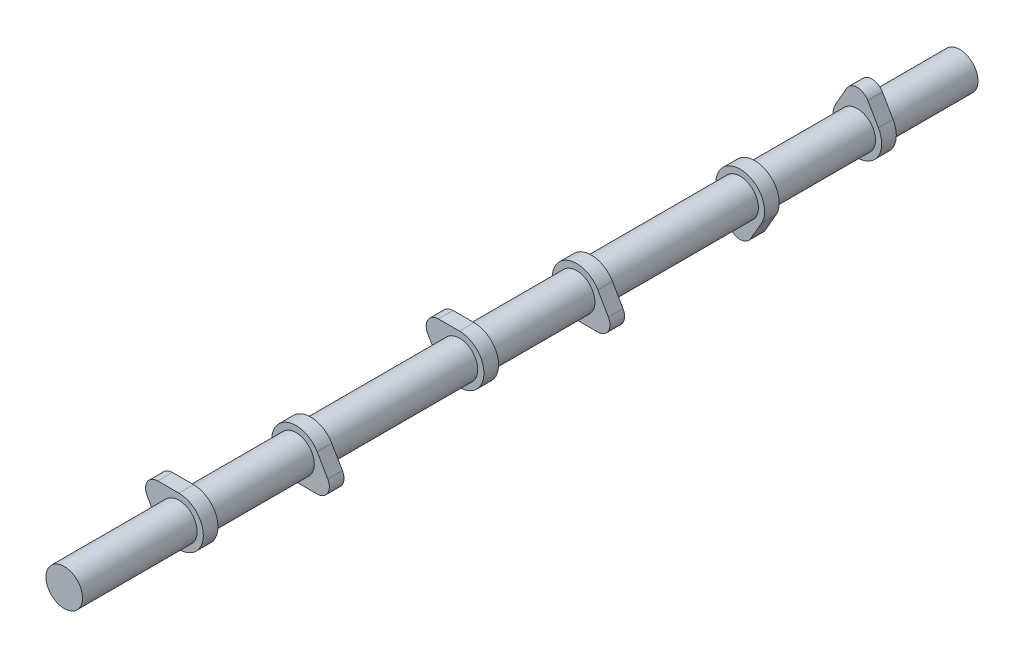
ISO-10303-21;
HEADER;
FILE_DESCRIPTION(('STEP AP214'),'2;1');
FILE_NAME('part.step','',(''),(''),'','','');
FILE_SCHEMA(('AUTOMOTIVE_DESIGN { 1 0 10303 214 1 1 1 1 }'));
ENDSEC;
DATA;
#1=APPLICATION_CONTEXT('core data for automotive mechanical design processes');
#2=APPLICATION_PROTOCOL_DEFINITION('international standard','automotive_design',2000,#1);
#3=PRODUCT_CONTEXT('',#1,'mechanical');
#4=PRODUCT('Part','Part','',(#3));
#5=PRODUCT_RELATED_PRODUCT_CATEGORY('part','',(#4));
#6=PRODUCT_DEFINITION_FORMATION('','',#4);
#7=PRODUCT_DEFINITION_CONTEXT('part definition',#1,'design');
#8=PRODUCT_DEFINITION('design','',#6,#7);
#9=PRODUCT_DEFINITION_SHAPE('','',#8);
#10=(LENGTH_UNIT() NAMED_UNIT(*) SI_UNIT(.MILLI.,.METRE.));
#11=(NAMED_UNIT(*) PLANE_ANGLE_UNIT() SI_UNIT($,.RADIAN.));
#12=(NAMED_UNIT(*) SI_UNIT($,.STERADIAN.) SOLID_ANGLE_UNIT());
#13=UNCERTAINTY_MEASURE_WITH_UNIT(LENGTH_MEASURE(1.E-05),#10,'distance_accuracy_value','');
#14=(GEOMETRIC_REPRESENTATION_CONTEXT(3) GLOBAL_UNCERTAINTY_ASSIGNED_CONTEXT((#13)) GLOBAL_UNIT_ASSIGNED_CONTEXT((#10,
#11,#12)) REPRESENTATION_CONTEXT('',''));
#15=CARTESIAN_POINT('',(0.,0.,0.));
#16=DIRECTION('',(0.,0.,1.));
#17=DIRECTION('',(1.,0.,0.));
#18=AXIS2_PLACEMENT_3D('',#15,#16,#17);
#19=CARTESIAN_POINT('',(0.,0.,124.46));
#20=DIRECTION('',(0.,0.,-1.));
#21=DIRECTION('',(-1.,0.,0.));
#22=AXIS2_PLACEMENT_3D('',#19,#20,#21);
#23=CYLINDRICAL_SURFACE('',#22,9.5);
#24=CARTESIAN_POINT('',(0.,0.,64.77));
#25=DIRECTION('',(0.,0.,1.));
#26=DIRECTION('',(1.,0.,0.));
#27=AXIS2_PLACEMENT_3D('',#24,#25,#26);
#28=CIRCLE('',#27,9.5);
#29=CARTESIAN_POINT('',(9.5,0.,64.77));
#30=VERTEX_POINT('',#29);
#31=EDGE_CURVE('E246',#30,#30,#28,.T.);
#32=ORIENTED_EDGE('',*,*,#31,.T.);
#33=EDGE_LOOP('',(#32));
#34=FACE_BOUND('',#33,.T.);
#35=CARTESIAN_POINT('',(0.,0.,142.24));
#36=DIRECTION('',(0.,0.,1.));
#37=DIRECTION('',(1.,0.,0.));
#38=AXIS2_PLACEMENT_3D('',#35,#36,#37);
#39=CIRCLE('',#38,9.5);
#40=CARTESIAN_POINT('',(9.5,0.,142.24));
#41=VERTEX_POINT('',#40);
#42=EDGE_CURVE('E392',#41,#41,#39,.F.);
#43=ORIENTED_EDGE('',*,*,#42,.T.);
#44=EDGE_LOOP('',(#43));
#45=FACE_BOUND('',#44,.T.);
#46=ADVANCED_FACE('F47',(#34,#45),#23,.T.);
#47=CARTESIAN_POINT('',(10.9985226280624,-6.3499999999999,295.91));
#48=DIRECTION('',(0.,0.,-1.));
#49=DIRECTION('',(0.499999999999992,0.866025403784443,0.));
#50=AXIS2_PLACEMENT_3D('',#47,#48,#49);
#51=CYLINDRICAL_SURFACE('',#50,6.35);
#52=CARTESIAN_POINT('',(10.9985226280624,-6.3499999999999,288.29));
#53=DIRECTION('',(0.,0.,1.));
#54=DIRECTION('',(-0.499999999999992,-0.866025403784443,0.));
#55=AXIS2_PLACEMENT_3D('',#52,#53,#54);
#56=CIRCLE('',#55,6.35);
#57=CARTESIAN_POINT('',(10.9985226280625,-12.6999999999999,288.29));
#58=VERTEX_POINT('',#57);
#59=CARTESIAN_POINT('',(16.4977839420936,-3.17499999999985,288.29));
#60=VERTEX_POINT('',#59);
#61=EDGE_CURVE('E398',#58,#60,#56,.T.);
#62=ORIENTED_EDGE('',*,*,#61,.T.);
#63=DIRECTION('',(0.,0.,-1.));
#64=VECTOR('',#63,1.);
#65=CARTESIAN_POINT('',(16.4977839420936,-3.17499999999985,295.91));
#66=LINE('',#65,#64);
#67=CARTESIAN_POINT('',(16.4977839420936,-3.17499999999985,295.91));
#68=VERTEX_POINT('',#67);
#69=EDGE_CURVE('E417',#68,#60,#66,.T.);
#70=ORIENTED_EDGE('',*,*,#69,.F.);
#71=CARTESIAN_POINT('',(10.9985226280624,-6.3499999999999,295.91));
#72=DIRECTION('',(0.,0.,1.));
#73=DIRECTION('',(-0.499999999999992,-0.866025403784443,0.));
#74=AXIS2_PLACEMENT_3D('',#71,#72,#73);
#75=CIRCLE('',#74,6.35);
#76=CARTESIAN_POINT('',(10.9985226280625,-12.6999999999999,295.91));
#77=VERTEX_POINT('',#76);
#78=EDGE_CURVE('E399',#77,#68,#75,.T.);
#79=ORIENTED_EDGE('',*,*,#78,.F.);
#80=DIRECTION('',(0.,0.,-1.));
#81=VECTOR('',#80,1.);
#82=CARTESIAN_POINT('',(10.9985226280625,-12.6999999999999,295.91));
#83=LINE('',#82,#81);
#84=EDGE_CURVE('E405',#77,#58,#83,.T.);
#85=ORIENTED_EDGE('',*,*,#84,.T.);
#86=EDGE_LOOP('',(#62,#70,#79,#85));
#87=FACE_BOUND('',#86,.T.);
#88=ADVANCED_FACE('F465',(#87),#51,.T.);
#89=CARTESIAN_POINT('',(16.4977839420936,-3.17499999999985,295.91));
#90=DIRECTION('',(-0.866025403784434,-0.500000000000008,0.));
#91=DIRECTION('',(0.500000000000009,-0.866025403784434,0.));
#92=AXIS2_PLACEMENT_3D('',#89,#90,#91);
#93=PLANE('',#92);
#94=DIRECTION('',(-0.500000000000009,0.866025403784434,0.));
#95=VECTOR('',#94,1.);
#96=CARTESIAN_POINT('',(16.4977839420936,-3.17499999999985,288.29));
#97=LINE('',#96,#95);
#98=CARTESIAN_POINT('',(10.9985226280623,6.3500000000001,288.29));
#99=VERTEX_POINT('',#98);
#100=EDGE_CURVE('E408',#60,#99,#97,.T.);
#101=ORIENTED_EDGE('',*,*,#100,.T.);
#102=DIRECTION('',(0.,0.,-1.));
#103=VECTOR('',#102,1.);
#104=CARTESIAN_POINT('',(10.9985226280623,6.3500000000001,295.91));
#105=LINE('',#104,#103);
#106=CARTESIAN_POINT('',(10.9985226280623,6.3500000000001,295.91));
#107=VERTEX_POINT('',#106);
#108=EDGE_CURVE('E415',#107,#99,#105,.T.);
#109=ORIENTED_EDGE('',*,*,#108,.F.);
#110=DIRECTION('',(-0.500000000000009,0.866025403784434,0.));
#111=VECTOR('',#110,1.);
#112=CARTESIAN_POINT('',(16.4977839420936,-3.17499999999985,295.91));
#113=LINE('',#112,#111);
#114=EDGE_CURVE('E98',#68,#107,#113,.T.);
#115=ORIENTED_EDGE('',*,*,#114,.F.);
#116=ORIENTED_EDGE('',*,*,#69,.T.);
#117=EDGE_LOOP('',(#101,#109,#115,#116));
#118=FACE_BOUND('',#117,.T.);
#119=ADVANCED_FACE('F469',(#118),#93,.F.);
#120=CARTESIAN_POINT('',(0.,0.,295.91));
#121=DIRECTION('',(0.,0.,-1.));
#122=DIRECTION('',(0.499999999999992,0.866025403784443,0.));
#123=AXIS2_PLACEMENT_3D('',#120,#121,#122);
#124=CYLINDRICAL_SURFACE('',#123,12.7);
#125=CARTESIAN_POINT('',(0.,0.,288.29));
#126=DIRECTION('',(0.,0.,1.));
#127=DIRECTION('',(-0.499999999999992,-0.866025403784443,0.));
#128=AXIS2_PLACEMENT_3D('',#125,#126,#127);
#129=CIRCLE('',#128,12.7);
#130=CARTESIAN_POINT('',(1.17961196366423E-13,-12.7,288.29));
#131=VERTEX_POINT('',#130);
#132=EDGE_CURVE('E84',#99,#131,#129,.T.);
#133=ORIENTED_EDGE('',*,*,#132,.T.);
#134=DIRECTION('',(0.,0.,-1.));
#135=VECTOR('',#134,1.);
#136=CARTESIAN_POINT('',(1.17961196366423E-13,-12.7,295.91));
#137=LINE('',#136,#135);
#138=CARTESIAN_POINT('',(1.17961196366423E-13,-12.7,295.91));
#139=VERTEX_POINT('',#138);
#140=EDGE_CURVE('E413',#139,#131,#137,.T.);
#141=ORIENTED_EDGE('',*,*,#140,.F.);
#142=CARTESIAN_POINT('',(0.,0.,295.91));
#143=DIRECTION('',(0.,0.,1.));
#144=DIRECTION('',(-0.499999999999992,-0.866025403784443,0.));
#145=AXIS2_PLACEMENT_3D('',#142,#143,#144);
#146=CIRCLE('',#145,12.7);
#147=EDGE_CURVE('E402',#107,#139,#146,.T.);
#148=ORIENTED_EDGE('',*,*,#147,.F.);
#149=ORIENTED_EDGE('',*,*,#108,.T.);
#150=EDGE_LOOP('',(#133,#141,#148,#149));
#151=FACE_BOUND('',#150,.T.);
#152=ADVANCED_FACE('F816',(#151),#124,.T.);
#153=CARTESIAN_POINT('',(10.9985226280625,-12.6999999999999,295.91));
#154=DIRECTION('',(0.,1.,0.));
#155=DIRECTION('',(-1.,0.,0.));
#156=AXIS2_PLACEMENT_3D('',#153,#154,#155);
#157=PLANE('',#156);
#158=DIRECTION('',(1.,0.,0.));
#159=VECTOR('',#158,1.);
#160=CARTESIAN_POINT('',(10.9985226280625,-12.6999999999999,288.29));
#161=LINE('',#160,#159);
#162=EDGE_CURVE('E90',#131,#58,#161,.T.);
#163=ORIENTED_EDGE('',*,*,#162,.T.);
#164=ORIENTED_EDGE('',*,*,#84,.F.);
#165=DIRECTION('',(1.,0.,0.));
#166=VECTOR('',#165,1.);
#167=CARTESIAN_POINT('',(10.9985226280625,-12.6999999999999,295.91));
#168=LINE('',#167,#166);
#169=EDGE_CURVE('E66',#139,#77,#168,.T.);
#170=ORIENTED_EDGE('',*,*,#169,.F.);
#171=ORIENTED_EDGE('',*,*,#140,.T.);
#172=EDGE_LOOP('',(#163,#164,#170,#171));
#173=FACE_BOUND('',#172,.T.);
#174=ADVANCED_FACE('F806',(#173),#157,.F.);
#175=CARTESIAN_POINT('',(10.9985226280624,-6.3499999999999,295.91));
#176=DIRECTION('',(0.,0.,1.));
#177=DIRECTION('',(-0.499999999999992,-0.866025403784443,0.));
#178=AXIS2_PLACEMENT_3D('',#175,#176,#177);
#179=PLANE('',#178);
#180=CARTESIAN_POINT('',(0.,0.,295.91));
#181=DIRECTION('',(0.,0.,1.));
#182=DIRECTION('',(1.,0.,0.));
#183=AXIS2_PLACEMENT_3D('',#180,#181,#182);
#184=CIRCLE('',#183,9.5);
#185=CARTESIAN_POINT('',(9.5,0.,295.91));
#186=VERTEX_POINT('',#185);
#187=EDGE_CURVE('E395',#186,#186,#184,.F.);
#188=ORIENTED_EDGE('',*,*,#187,.T.);
#189=EDGE_LOOP('',(#188));
#190=FACE_BOUND('',#189,.T.);
#191=ORIENTED_EDGE('',*,*,#78,.T.);
#192=ORIENTED_EDGE('',*,*,#114,.T.);
#193=ORIENTED_EDGE('',*,*,#147,.T.);
#194=ORIENTED_EDGE('',*,*,#169,.T.);
#195=EDGE_LOOP('',(#191,#192,#193,#194));
#196=FACE_BOUND('',#195,.T.);
#197=ADVANCED_FACE('F796',(#190,#196),#179,.T.);
#198=CARTESIAN_POINT('',(10.9985226280624,-6.3499999999999,288.29));
#199=DIRECTION('',(0.,0.,1.));
#200=DIRECTION('',(-0.499999999999992,-0.866025403784443,0.));
#201=AXIS2_PLACEMENT_3D('',#198,#199,#200);
#202=PLANE('',#201);
#203=CARTESIAN_POINT('',(0.,0.,288.29));
#204=DIRECTION('',(0.,0.,1.));
#205=DIRECTION('',(1.,0.,0.));
#206=AXIS2_PLACEMENT_3D('',#203,#204,#205);
#207=CIRCLE('',#206,9.5);
#208=CARTESIAN_POINT('',(9.5,0.,288.29));
#209=VERTEX_POINT('',#208);
#210=EDGE_CURVE('E419',#209,#209,#207,.F.);
#211=ORIENTED_EDGE('',*,*,#210,.F.);
#212=EDGE_LOOP('',(#211));
#213=FACE_BOUND('',#212,.T.);
#214=ORIENTED_EDGE('',*,*,#61,.F.);
#215=ORIENTED_EDGE('',*,*,#162,.F.);
#216=ORIENTED_EDGE('',*,*,#132,.F.);
#217=ORIENTED_EDGE('',*,*,#100,.F.);
#218=EDGE_LOOP('',(#214,#215,#216,#217));
#219=FACE_BOUND('',#218,.T.);
#220=ADVANCED_FACE('F786',(#213,#219),#202,.F.);
#221=CARTESIAN_POINT('',(0.,0.,270.51));
#222=DIRECTION('',(0.,0.,-1.));
#223=DIRECTION('',(-1.,0.,0.));
#224=AXIS2_PLACEMENT_3D('',#221,#222,#223);
#225=CYLINDRICAL_SURFACE('',#224,9.5);
#226=CARTESIAN_POINT('',(0.,0.,149.86));
#227=DIRECTION('',(0.,0.,1.));
#228=DIRECTION('',(1.,0.,0.));
#229=AXIS2_PLACEMENT_3D('',#226,#227,#228);
#230=CIRCLE('',#229,9.5);
#231=CARTESIAN_POINT('',(9.5,0.,149.86));
#232=VERTEX_POINT('',#231);
#233=EDGE_CURVE('E357',#232,#232,#230,.F.);
#234=ORIENTED_EDGE('',*,*,#233,.F.);
#235=EDGE_LOOP('',(#234));
#236=FACE_BOUND('',#235,.T.);
#237=CARTESIAN_POINT('',(0.,0.,203.2));
#238=DIRECTION('',(0.,0.,1.));
#239=DIRECTION('',(1.,0.,0.));
#240=AXIS2_PLACEMENT_3D('',#237,#238,#239);
#241=CIRCLE('',#240,9.5);
#242=CARTESIAN_POINT('',(9.5,0.,203.2));
#243=VERTEX_POINT('',#242);
#244=EDGE_CURVE('E346',#243,#243,#241,.T.);
#245=ORIENTED_EDGE('',*,*,#244,.F.);
#246=EDGE_LOOP('',(#245));
#247=FACE_BOUND('',#246,.T.);
#248=ADVANCED_FACE('F776',(#236,#247),#225,.T.);
#249=CARTESIAN_POINT('',(-10.9985226280623,6.35000000000013,203.2));
#250=DIRECTION('',(0.,0.,1.));
#251=DIRECTION('',(0.50000000000001,0.866025403784433,0.));
#252=AXIS2_PLACEMENT_3D('',#249,#250,#251);
#253=PLANE('',#252);
#254=ORIENTED_EDGE('',*,*,#244,.T.);
#255=EDGE_LOOP('',(#254));
#256=FACE_BOUND('',#255,.T.);
#257=CARTESIAN_POINT('',(-10.9985226280623,6.35000000000013,203.2));
#258=DIRECTION('',(0.,0.,1.));
#259=DIRECTION('',(0.50000000000001,0.866025403784433,0.));
#260=AXIS2_PLACEMENT_3D('',#257,#258,#259);
#261=CIRCLE('',#260,6.35);
#262=CARTESIAN_POINT('',(-10.9985226280622,12.7000000000001,203.2));
#263=VERTEX_POINT('',#262);
#264=CARTESIAN_POINT('',(-16.4977839420935,3.17500000000019,203.2));
#265=VERTEX_POINT('',#264);
#266=EDGE_CURVE('E326',#263,#265,#261,.T.);
#267=ORIENTED_EDGE('',*,*,#266,.F.);
#268=DIRECTION('',(-1.,0.,0.));
#269=VECTOR('',#268,1.);
#270=CARTESIAN_POINT('',(-10.9985226280622,12.7000000000001,203.2));
#271=LINE('',#270,#269);
#272=CARTESIAN_POINT('',(1.47451495458029E-13,12.7,203.2));
#273=VERTEX_POINT('',#272);
#274=EDGE_CURVE('E319',#273,#263,#271,.T.);
#275=ORIENTED_EDGE('',*,*,#274,.F.);
#276=CARTESIAN_POINT('',(0.,0.,203.2));
#277=DIRECTION('',(0.,0.,1.));
#278=DIRECTION('',(0.50000000000001,0.866025403784433,0.));
#279=AXIS2_PLACEMENT_3D('',#276,#277,#278);
#280=CIRCLE('',#279,12.7);
#281=CARTESIAN_POINT('',(-10.9985226280624,-6.34999999999987,203.2));
#282=VERTEX_POINT('',#281);
#283=EDGE_CURVE('E331',#282,#273,#280,.T.);
#284=ORIENTED_EDGE('',*,*,#283,.F.);
#285=DIRECTION('',(0.499999999999991,-0.866025403784444,0.));
#286=VECTOR('',#285,1.);
#287=CARTESIAN_POINT('',(-16.4977839420935,3.17500000000019,203.2));
#288=LINE('',#287,#286);
#289=EDGE_CURVE('E329',#265,#282,#288,.T.);
#290=ORIENTED_EDGE('',*,*,#289,.F.);
#291=EDGE_LOOP('',(#267,#275,#284,#290));
#292=FACE_BOUND('',#291,.T.);
#293=ADVANCED_FACE('F766',(#256,#292),#253,.F.);
#294=CARTESIAN_POINT('',(-10.9985226280623,6.35000000000013,210.82));
#295=DIRECTION('',(0.,0.,1.));
#296=DIRECTION('',(0.50000000000001,0.866025403784433,0.));
#297=AXIS2_PLACEMENT_3D('',#294,#295,#296);
#298=PLANE('',#297);
#299=CARTESIAN_POINT('',(0.,0.,210.82));
#300=DIRECTION('',(0.,0.,1.));
#301=DIRECTION('',(1.,0.,0.));
#302=AXIS2_PLACEMENT_3D('',#299,#300,#301);
#303=CIRCLE('',#302,9.5);
#304=CARTESIAN_POINT('',(9.5,0.,210.82));
#305=VERTEX_POINT('',#304);
#306=EDGE_CURVE('E345',#305,#305,#303,.T.);
#307=ORIENTED_EDGE('',*,*,#306,.F.);
#308=EDGE_LOOP('',(#307));
#309=FACE_BOUND('',#308,.T.);
#310=CARTESIAN_POINT('',(-10.9985226280623,6.35000000000013,210.82));
#311=DIRECTION('',(0.,0.,1.));
#312=DIRECTION('',(0.50000000000001,0.866025403784433,0.));
#313=AXIS2_PLACEMENT_3D('',#310,#311,#312);
#314=CIRCLE('',#313,6.35);
#315=CARTESIAN_POINT('',(-10.9985226280622,12.7000000000001,210.82));
#316=VERTEX_POINT('',#315);
#317=CARTESIAN_POINT('',(-16.4977839420935,3.17500000000019,210.82));
#318=VERTEX_POINT('',#317);
#319=EDGE_CURVE('E315',#316,#318,#314,.T.);
#320=ORIENTED_EDGE('',*,*,#319,.T.);
#321=DIRECTION('',(0.499999999999991,-0.866025403784444,0.));
#322=VECTOR('',#321,1.);
#323=CARTESIAN_POINT('',(-16.4977839420935,3.17500000000019,210.82));
#324=LINE('',#323,#322);
#325=CARTESIAN_POINT('',(-10.9985226280624,-6.34999999999987,210.82));
#326=VERTEX_POINT('',#325);
#327=EDGE_CURVE('E318',#318,#326,#324,.T.);
#328=ORIENTED_EDGE('',*,*,#327,.T.);
#329=CARTESIAN_POINT('',(0.,0.,210.82));
#330=DIRECTION('',(0.,0.,1.));
#331=DIRECTION('',(0.50000000000001,0.866025403784433,0.));
#332=AXIS2_PLACEMENT_3D('',#329,#330,#331);
#333=CIRCLE('',#332,12.7);
#334=CARTESIAN_POINT('',(1.47451495458029E-13,12.7,210.82));
#335=VERTEX_POINT('',#334);
#336=EDGE_CURVE('E321',#326,#335,#333,.T.);
#337=ORIENTED_EDGE('',*,*,#336,.T.);
#338=DIRECTION('',(-1.,0.,0.));
#339=VECTOR('',#338,1.);
#340=CARTESIAN_POINT('',(-10.9985226280622,12.7000000000001,210.82));
#341=LINE('',#340,#339);
#342=EDGE_CURVE('E323',#335,#316,#341,.T.);
#343=ORIENTED_EDGE('',*,*,#342,.T.);
#344=EDGE_LOOP('',(#320,#328,#337,#343));
#345=FACE_BOUND('',#344,.T.);
#346=ADVANCED_FACE('F756',(#309,#345),#298,.T.);
#347=CARTESIAN_POINT('',(-10.9985226280622,12.7000000000001,210.82));
#348=DIRECTION('',(0.,-1.,0.));
#349=DIRECTION('',(1.,0.,0.));
#350=AXIS2_PLACEMENT_3D('',#347,#348,#349);
#351=PLANE('',#350);
#352=ORIENTED_EDGE('',*,*,#274,.T.);
#353=DIRECTION('',(0.,0.,-1.));
#354=VECTOR('',#353,1.);
#355=CARTESIAN_POINT('',(-10.9985226280622,12.7000000000001,210.82));
#356=LINE('',#355,#354);
#357=EDGE_CURVE('E325',#316,#263,#356,.T.);
#358=ORIENTED_EDGE('',*,*,#357,.F.);
#359=ORIENTED_EDGE('',*,*,#342,.F.);
#360=DIRECTION('',(0.,0.,-1.));
#361=VECTOR('',#360,1.);
#362=CARTESIAN_POINT('',(1.47451495458029E-13,12.7,210.82));
#363=LINE('',#362,#361);
#364=EDGE_CURVE('E336',#335,#273,#363,.T.);
#365=ORIENTED_EDGE('',*,*,#364,.T.);
#366=EDGE_LOOP('',(#352,#358,#359,#365));
#367=FACE_BOUND('',#366,.T.);
#368=ADVANCED_FACE('F746',(#367),#351,.F.);
#369=CARTESIAN_POINT('',(0.,0.,210.82));
#370=DIRECTION('',(0.,0.,-1.));
#371=DIRECTION('',(-0.50000000000001,-0.866025403784433,0.));
#372=AXIS2_PLACEMENT_3D('',#369,#370,#371);
#373=CYLINDRICAL_SURFACE('',#372,12.7);
#374=ORIENTED_EDGE('',*,*,#283,.T.);
#375=ORIENTED_EDGE('',*,*,#364,.F.);
#376=ORIENTED_EDGE('',*,*,#336,.F.);
#377=DIRECTION('',(0.,0.,-1.));
#378=VECTOR('',#377,1.);
#379=CARTESIAN_POINT('',(-10.9985226280624,-6.34999999999987,210.82));
#380=LINE('',#379,#378);
#381=EDGE_CURVE('E339',#326,#282,#380,.T.);
#382=ORIENTED_EDGE('',*,*,#381,.T.);
#383=EDGE_LOOP('',(#374,#375,#376,#382));
#384=FACE_BOUND('',#383,.T.);
#385=ADVANCED_FACE('F736',(#384),#373,.T.);
#386=CARTESIAN_POINT('',(-16.4977839420935,3.17500000000019,210.82));
#387=DIRECTION('',(0.866025403784444,0.499999999999991,0.));
#388=DIRECTION('',(-0.499999999999991,0.866025403784444,0.));
#389=AXIS2_PLACEMENT_3D('',#386,#387,#388);
#390=PLANE('',#389);
#391=ORIENTED_EDGE('',*,*,#289,.T.);
#392=ORIENTED_EDGE('',*,*,#381,.F.);
#393=ORIENTED_EDGE('',*,*,#327,.F.);
#394=DIRECTION('',(0.,0.,-1.));
#395=VECTOR('',#394,1.);
#396=CARTESIAN_POINT('',(-16.4977839420935,3.17500000000019,210.82));
#397=LINE('',#396,#395);
#398=EDGE_CURVE('E342',#318,#265,#397,.T.);
#399=ORIENTED_EDGE('',*,*,#398,.T.);
#400=EDGE_LOOP('',(#391,#392,#393,#399));
#401=FACE_BOUND('',#400,.T.);
#402=ADVANCED_FACE('F726',(#401),#390,.F.);
#403=CARTESIAN_POINT('',(-10.9985226280623,6.35000000000013,210.82));
#404=DIRECTION('',(0.,0.,-1.));
#405=DIRECTION('',(-0.50000000000001,-0.866025403784433,0.));
#406=AXIS2_PLACEMENT_3D('',#403,#404,#405);
#407=CYLINDRICAL_SURFACE('',#406,6.35);
#408=ORIENTED_EDGE('',*,*,#266,.T.);
#409=ORIENTED_EDGE('',*,*,#398,.F.);
#410=ORIENTED_EDGE('',*,*,#319,.F.);
#411=ORIENTED_EDGE('',*,*,#357,.T.);
#412=EDGE_LOOP('',(#408,#409,#410,#411));
#413=FACE_BOUND('',#412,.T.);
#414=ADVANCED_FACE('F716',(#413),#407,.T.);
#415=CARTESIAN_POINT('',(10.9985226280623,-6.35000000000005,142.24));
#416=DIRECTION('',(0.,0.,1.));
#417=DIRECTION('',(-0.500000000000004,-0.866025403784436,0.));
#418=AXIS2_PLACEMENT_3D('',#415,#416,#417);
#419=PLANE('',#418);
#420=ORIENTED_EDGE('',*,*,#42,.F.);
#421=EDGE_LOOP('',(#420));
#422=FACE_BOUND('',#421,.T.);
#423=CARTESIAN_POINT('',(10.9985226280623,-6.35000000000005,142.24));
#424=DIRECTION('',(0.,0.,1.));
#425=DIRECTION('',(-0.500000000000004,-0.866025403784436,0.));
#426=AXIS2_PLACEMENT_3D('',#423,#424,#425);
#427=CIRCLE('',#426,6.35);
#428=CARTESIAN_POINT('',(10.9985226280623,-12.7000000000001,142.24));
#429=VERTEX_POINT('',#428);
#430=CARTESIAN_POINT('',(16.4977839420935,-3.17500000000008,142.24));
#431=VERTEX_POINT('',#430);
#432=EDGE_CURVE('E362',#429,#431,#427,.T.);
#433=ORIENTED_EDGE('',*,*,#432,.F.);
#434=DIRECTION('',(1.,0.,0.));
#435=VECTOR('',#434,1.);
#436=CARTESIAN_POINT('',(10.9985226280623,-12.7000000000001,142.24));
#437=LINE('',#436,#435);
#438=CARTESIAN_POINT('',(0.,-12.7,142.24));
#439=VERTEX_POINT('',#438);
#440=EDGE_CURVE('E367',#439,#429,#437,.T.);
#441=ORIENTED_EDGE('',*,*,#440,.F.);
#442=CARTESIAN_POINT('',(0.,0.,142.24));
#443=DIRECTION('',(0.,0.,1.));
#444=DIRECTION('',(-0.500000000000004,-0.866025403784436,0.));
#445=AXIS2_PLACEMENT_3D('',#442,#443,#444);
#446=CIRCLE('',#445,12.7);
#447=CARTESIAN_POINT('',(10.9985226280624,6.34999999999995,142.24));
#448=VERTEX_POINT('',#447);
#449=EDGE_CURVE('E378',#448,#439,#446,.T.);
#450=ORIENTED_EDGE('',*,*,#449,.F.);
#451=DIRECTION('',(-0.499999999999997,0.866025403784441,0.));
#452=VECTOR('',#451,1.);
#453=CARTESIAN_POINT('',(16.4977839420935,-3.17500000000008,142.24));
#454=LINE('',#453,#452);
#455=EDGE_CURVE('E376',#431,#448,#454,.T.);
#456=ORIENTED_EDGE('',*,*,#455,.F.);
#457=EDGE_LOOP('',(#433,#441,#450,#456));
#458=FACE_BOUND('',#457,.T.);
#459=ADVANCED_FACE('F706',(#422,#458),#419,.F.);
#460=CARTESIAN_POINT('',(10.9985226280623,-6.35000000000005,149.86));
#461=DIRECTION('',(0.,0.,1.));
#462=DIRECTION('',(-0.500000000000004,-0.866025403784436,0.));
#463=AXIS2_PLACEMENT_3D('',#460,#461,#462);
#464=PLANE('',#463);
#465=ORIENTED_EDGE('',*,*,#233,.T.);
#466=EDGE_LOOP('',(#465));
#467=FACE_BOUND('',#466,.T.);
#468=CARTESIAN_POINT('',(10.9985226280623,-6.35000000000005,149.86));
#469=DIRECTION('',(0.,0.,1.));
#470=DIRECTION('',(-0.500000000000004,-0.866025403784436,0.));
#471=AXIS2_PLACEMENT_3D('',#468,#469,#470);
#472=CIRCLE('',#471,6.35);
#473=CARTESIAN_POINT('',(10.9985226280623,-12.7000000000001,149.86));
#474=VERTEX_POINT('',#473);
#475=CARTESIAN_POINT('',(16.4977839420935,-3.17500000000008,149.86));
#476=VERTEX_POINT('',#475);
#477=EDGE_CURVE('E363',#474,#476,#472,.T.);
#478=ORIENTED_EDGE('',*,*,#477,.T.);
#479=DIRECTION('',(-0.499999999999997,0.866025403784441,0.));
#480=VECTOR('',#479,1.);
#481=CARTESIAN_POINT('',(16.4977839420935,-3.17500000000008,149.86));
#482=LINE('',#481,#480);
#483=CARTESIAN_POINT('',(10.9985226280624,6.34999999999995,149.86));
#484=VERTEX_POINT('',#483);
#485=EDGE_CURVE('E366',#476,#484,#482,.T.);
#486=ORIENTED_EDGE('',*,*,#485,.T.);
#487=CARTESIAN_POINT('',(0.,0.,149.86));
#488=DIRECTION('',(0.,0.,1.));
#489=DIRECTION('',(-0.500000000000004,-0.866025403784436,0.));
#490=AXIS2_PLACEMENT_3D('',#487,#488,#489);
#491=CIRCLE('',#490,12.7);
#492=CARTESIAN_POINT('',(0.,-12.7,149.86));
#493=VERTEX_POINT('',#492);
#494=EDGE_CURVE('E369',#484,#493,#491,.T.);
#495=ORIENTED_EDGE('',*,*,#494,.T.);
#496=DIRECTION('',(1.,0.,0.));
#497=VECTOR('',#496,1.);
#498=CARTESIAN_POINT('',(10.9985226280623,-12.7000000000001,149.86));
#499=LINE('',#498,#497);
#500=EDGE_CURVE('E371',#493,#474,#499,.T.);
#501=ORIENTED_EDGE('',*,*,#500,.T.);
#502=EDGE_LOOP('',(#478,#486,#495,#501));
#503=FACE_BOUND('',#502,.T.);
#504=ADVANCED_FACE('F696',(#467,#503),#464,.T.);
#505=CARTESIAN_POINT('',(10.9985226280623,-12.7000000000001,149.86));
#506=DIRECTION('',(0.,1.,0.));
#507=DIRECTION('',(-1.,0.,0.));
#508=AXIS2_PLACEMENT_3D('',#505,#506,#507);
#509=PLANE('',#508);
#510=ORIENTED_EDGE('',*,*,#440,.T.);
#511=DIRECTION('',(0.,0.,-1.));
#512=VECTOR('',#511,1.);
#513=CARTESIAN_POINT('',(10.9985226280623,-12.7000000000001,149.86));
#514=LINE('',#513,#512);
#515=EDGE_CURVE('E373',#474,#429,#514,.T.);
#516=ORIENTED_EDGE('',*,*,#515,.F.);
#517=ORIENTED_EDGE('',*,*,#500,.F.);
#518=DIRECTION('',(0.,0.,-1.));
#519=VECTOR('',#518,1.);
#520=CARTESIAN_POINT('',(0.,-12.7,149.86));
#521=LINE('',#520,#519);
#522=EDGE_CURVE('E383',#493,#439,#521,.T.);
#523=ORIENTED_EDGE('',*,*,#522,.T.);
#524=EDGE_LOOP('',(#510,#516,#517,#523));
#525=FACE_BOUND('',#524,.T.);
#526=ADVANCED_FACE('F686',(#525),#509,.F.);
#527=CARTESIAN_POINT('',(0.,0.,149.86));
#528=DIRECTION('',(0.,0.,-1.));
#529=DIRECTION('',(0.500000000000004,0.866025403784436,0.));
#530=AXIS2_PLACEMENT_3D('',#527,#528,#529);
#531=CYLINDRICAL_SURFACE('',#530,12.7);
#532=ORIENTED_EDGE('',*,*,#449,.T.);
#533=ORIENTED_EDGE('',*,*,#522,.F.);
#534=ORIENTED_EDGE('',*,*,#494,.F.);
#535=DIRECTION('',(0.,0.,-1.));
#536=VECTOR('',#535,1.);
#537=CARTESIAN_POINT('',(10.9985226280624,6.34999999999995,149.86));
#538=LINE('',#537,#536);
#539=EDGE_CURVE('E386',#484,#448,#538,.T.);
#540=ORIENTED_EDGE('',*,*,#539,.T.);
#541=EDGE_LOOP('',(#532,#533,#534,#540));
#542=FACE_BOUND('',#541,.T.);
#543=ADVANCED_FACE('F676',(#542),#531,.T.);
#544=CARTESIAN_POINT('',(16.4977839420935,-3.17500000000008,149.86));
#545=DIRECTION('',(-0.866025403784441,-0.499999999999996,0.));
#546=DIRECTION('',(0.499999999999997,-0.866025403784441,0.));
#547=AXIS2_PLACEMENT_3D('',#544,#545,#546);
#548=PLANE('',#547);
#549=ORIENTED_EDGE('',*,*,#455,.T.);
#550=ORIENTED_EDGE('',*,*,#539,.F.);
#551=ORIENTED_EDGE('',*,*,#485,.F.);
#552=DIRECTION('',(0.,0.,-1.));
#553=VECTOR('',#552,1.);
#554=CARTESIAN_POINT('',(16.4977839420935,-3.17500000000008,149.86));
#555=LINE('',#554,#553);
#556=EDGE_CURVE('E389',#476,#431,#555,.T.);
#557=ORIENTED_EDGE('',*,*,#556,.T.);
#558=EDGE_LOOP('',(#549,#550,#551,#557));
#559=FACE_BOUND('',#558,.T.);
#560=ADVANCED_FACE('F666',(#559),#548,.F.);
#561=CARTESIAN_POINT('',(10.9985226280623,-6.35000000000005,149.86));
#562=DIRECTION('',(0.,0.,-1.));
#563=DIRECTION('',(0.500000000000004,0.866025403784436,0.));
#564=AXIS2_PLACEMENT_3D('',#561,#562,#563);
#565=CYLINDRICAL_SURFACE('',#564,6.35);
#566=ORIENTED_EDGE('',*,*,#432,.T.);
#567=ORIENTED_EDGE('',*,*,#556,.F.);
#568=ORIENTED_EDGE('',*,*,#477,.F.);
#569=ORIENTED_EDGE('',*,*,#515,.T.);
#570=EDGE_LOOP('',(#566,#567,#568,#569));
#571=FACE_BOUND('',#570,.T.);
#572=ADVANCED_FACE('F657',(#571),#565,.T.);
#573=CARTESIAN_POINT('',(0.,0.,416.56));
#574=DIRECTION('',(0.,0.,-1.));
#575=DIRECTION('',(0.499999999999992,0.866025403784443,0.));
#576=AXIS2_PLACEMENT_3D('',#573,#574,#575);
#577=CYLINDRICAL_SURFACE('',#576,9.5);
#578=ORIENTED_EDGE('',*,*,#306,.T.);
#579=EDGE_LOOP('',(#578));
#580=FACE_BOUND('',#579,.T.);
#581=ORIENTED_EDGE('',*,*,#210,.T.);
#582=EDGE_LOOP('',(#581));
#583=FACE_BOUND('',#582,.T.);
#584=ADVANCED_FACE('F570',(#580,#583),#577,.T.);
#585=ORIENTED_EDGE('',*,*,#187,.F.);
#586=EDGE_LOOP('',(#585));
#587=FACE_BOUND('',#586,.T.);
#588=CARTESIAN_POINT('',(0.,0.,349.25));
#589=DIRECTION('',(0.,0.,1.));
#590=DIRECTION('',(1.,0.,0.));
#591=AXIS2_PLACEMENT_3D('',#588,#589,#590);
#592=CIRCLE('',#591,9.5);
#593=CARTESIAN_POINT('',(9.5,0.,349.25));
#594=VERTEX_POINT('',#593);
#595=EDGE_CURVE('E354',#594,#594,#592,.T.);
#596=ORIENTED_EDGE('',*,*,#595,.F.);
#597=EDGE_LOOP('',(#596));
#598=FACE_BOUND('',#597,.T.);
#599=ADVANCED_FACE('F571',(#587,#598),#577,.T.);
#600=CARTESIAN_POINT('',(-10.9985226280624,6.34999999999997,356.87));
#601=DIRECTION('',(0.,0.,-1.));
#602=DIRECTION('',(-0.499999999999998,-0.86602540378444,0.));
#603=AXIS2_PLACEMENT_3D('',#600,#601,#602);
#604=CYLINDRICAL_SURFACE('',#603,6.35);
#605=CARTESIAN_POINT('',(-10.9985226280624,6.34999999999997,349.25));
#606=DIRECTION('',(0.,0.,1.));
#607=DIRECTION('',(0.499999999999998,0.86602540378444,0.));
#608=AXIS2_PLACEMENT_3D('',#605,#606,#607);
#609=CIRCLE('',#608,6.35);
#610=CARTESIAN_POINT('',(-10.9985226280624,12.7,349.25));
#611=VERTEX_POINT('',#610);
#612=CARTESIAN_POINT('',(-16.4977839420936,3.17499999999996,349.25));
#613=VERTEX_POINT('',#612);
#614=EDGE_CURVE('E295',#611,#613,#609,.T.);
#615=ORIENTED_EDGE('',*,*,#614,.T.);
#616=DIRECTION('',(0.,0.,-1.));
#617=VECTOR('',#616,1.);
#618=CARTESIAN_POINT('',(-16.4977839420936,3.17499999999996,356.87));
#619=LINE('',#618,#617);
#620=CARTESIAN_POINT('',(-16.4977839420936,3.17499999999996,356.87));
#621=VERTEX_POINT('',#620);
#622=EDGE_CURVE('E311',#621,#613,#619,.T.);
#623=ORIENTED_EDGE('',*,*,#622,.F.);
#624=CARTESIAN_POINT('',(-10.9985226280624,6.34999999999997,356.87));
#625=DIRECTION('',(0.,0.,1.));
#626=DIRECTION('',(0.499999999999998,0.86602540378444,0.));
#627=AXIS2_PLACEMENT_3D('',#624,#625,#626);
#628=CIRCLE('',#627,6.35);
#629=CARTESIAN_POINT('',(-10.9985226280624,12.7,356.87));
#630=VERTEX_POINT('',#629);
#631=EDGE_CURVE('E284',#630,#621,#628,.T.);
#632=ORIENTED_EDGE('',*,*,#631,.F.);
#633=DIRECTION('',(0.,0.,-1.));
#634=VECTOR('',#633,1.);
#635=CARTESIAN_POINT('',(-10.9985226280624,12.7,356.87));
#636=LINE('',#635,#634);
#637=EDGE_CURVE('E294',#630,#611,#636,.T.);
#638=ORIENTED_EDGE('',*,*,#637,.T.);
#639=EDGE_LOOP('',(#615,#623,#632,#638));
#640=FACE_BOUND('',#639,.T.);
#641=ADVANCED_FACE('F629',(#640),#604,.T.);
#642=CARTESIAN_POINT('',(-16.4977839420936,3.17499999999996,356.87));
#643=DIRECTION('',(0.866025403784437,0.500000000000002,0.));
#644=DIRECTION('',(-0.500000000000003,0.866025403784437,0.));
#645=AXIS2_PLACEMENT_3D('',#642,#643,#644);
#646=PLANE('',#645);
#647=DIRECTION('',(0.500000000000003,-0.866025403784437,0.));
#648=VECTOR('',#647,1.);
#649=CARTESIAN_POINT('',(-16.4977839420936,3.17499999999996,349.25));
#650=LINE('',#649,#648);
#651=CARTESIAN_POINT('',(-10.9985226280624,-6.35000000000002,349.25));
#652=VERTEX_POINT('',#651);
#653=EDGE_CURVE('E298',#613,#652,#650,.T.);
#654=ORIENTED_EDGE('',*,*,#653,.T.);
#655=DIRECTION('',(0.,0.,-1.));
#656=VECTOR('',#655,1.);
#657=CARTESIAN_POINT('',(-10.9985226280624,-6.35000000000002,356.87));
#658=LINE('',#657,#656);
#659=CARTESIAN_POINT('',(-10.9985226280624,-6.35000000000002,356.87));
#660=VERTEX_POINT('',#659);
#661=EDGE_CURVE('E308',#660,#652,#658,.T.);
#662=ORIENTED_EDGE('',*,*,#661,.F.);
#663=DIRECTION('',(0.500000000000003,-0.866025403784437,0.));
#664=VECTOR('',#663,1.);
#665=CARTESIAN_POINT('',(-16.4977839420936,3.17499999999996,356.87));
#666=LINE('',#665,#664);
#667=EDGE_CURVE('E287',#621,#660,#666,.T.);
#668=ORIENTED_EDGE('',*,*,#667,.F.);
#669=ORIENTED_EDGE('',*,*,#622,.T.);
#670=EDGE_LOOP('',(#654,#662,#668,#669));
#671=FACE_BOUND('',#670,.T.);
#672=ADVANCED_FACE('F619',(#671),#646,.F.);
#673=CARTESIAN_POINT('',(0.,0.,356.87));
#674=DIRECTION('',(0.,0.,-1.));
#675=DIRECTION('',(-0.499999999999998,-0.86602540378444,0.));
#676=AXIS2_PLACEMENT_3D('',#673,#674,#675);
#677=CYLINDRICAL_SURFACE('',#676,12.7);
#678=CARTESIAN_POINT('',(0.,0.,349.25));
#679=DIRECTION('',(0.,0.,1.));
#680=DIRECTION('',(0.499999999999998,0.86602540378444,0.));
#681=AXIS2_PLACEMENT_3D('',#678,#679,#680);
#682=CIRCLE('',#681,12.7);
#683=CARTESIAN_POINT('',(0.,12.7,349.25));
#684=VERTEX_POINT('',#683);
#685=EDGE_CURVE('E300',#652,#684,#682,.T.);
#686=ORIENTED_EDGE('',*,*,#685,.T.);
#687=DIRECTION('',(0.,0.,-1.));
#688=VECTOR('',#687,1.);
#689=CARTESIAN_POINT('',(0.,12.7,356.87));
#690=LINE('',#689,#688);
#691=CARTESIAN_POINT('',(0.,12.7,356.87));
#692=VERTEX_POINT('',#691);
#693=EDGE_CURVE('E305',#692,#684,#690,.T.);
#694=ORIENTED_EDGE('',*,*,#693,.F.);
#695=CARTESIAN_POINT('',(0.,0.,356.87));
#696=DIRECTION('',(0.,0.,1.));
#697=DIRECTION('',(0.499999999999998,0.86602540378444,0.));
#698=AXIS2_PLACEMENT_3D('',#695,#696,#697);
#699=CIRCLE('',#698,12.7);
#700=EDGE_CURVE('E290',#660,#692,#699,.T.);
#701=ORIENTED_EDGE('',*,*,#700,.F.);
#702=ORIENTED_EDGE('',*,*,#661,.T.);
#703=EDGE_LOOP('',(#686,#694,#701,#702));
#704=FACE_BOUND('',#703,.T.);
#705=ADVANCED_FACE('F609',(#704),#677,.T.);
#706=CARTESIAN_POINT('',(-10.9985226280624,12.7,356.87));
#707=DIRECTION('',(0.,-1.,0.));
#708=DIRECTION('',(1.,0.,0.));
#709=AXIS2_PLACEMENT_3D('',#706,#707,#708);
#710=PLANE('',#709);
#711=DIRECTION('',(-1.,0.,0.));
#712=VECTOR('',#711,1.);
#713=CARTESIAN_POINT('',(-10.9985226280624,12.7,349.25));
#714=LINE('',#713,#712);
#715=EDGE_CURVE('E288',#684,#611,#714,.T.);
#716=ORIENTED_EDGE('',*,*,#715,.T.);
#717=ORIENTED_EDGE('',*,*,#637,.F.);
#718=DIRECTION('',(-1.,0.,0.));
#719=VECTOR('',#718,1.);
#720=CARTESIAN_POINT('',(-10.9985226280624,12.7,356.87));
#721=LINE('',#720,#719);
#722=EDGE_CURVE('E292',#692,#630,#721,.T.);
#723=ORIENTED_EDGE('',*,*,#722,.F.);
#724=ORIENTED_EDGE('',*,*,#693,.T.);
#725=EDGE_LOOP('',(#716,#717,#723,#724));
#726=FACE_BOUND('',#725,.T.);
#727=ADVANCED_FACE('F599',(#726),#710,.F.);
#728=CARTESIAN_POINT('',(-10.9985226280624,6.34999999999997,356.87));
#729=DIRECTION('',(0.,0.,1.));
#730=DIRECTION('',(0.499999999999998,0.86602540378444,0.));
#731=AXIS2_PLACEMENT_3D('',#728,#729,#730);
#732=PLANE('',#731);
#733=CARTESIAN_POINT('',(0.,0.,356.87));
#734=DIRECTION('',(0.,0.,1.));
#735=DIRECTION('',(1.,0.,0.));
#736=AXIS2_PLACEMENT_3D('',#733,#734,#735);
#737=CIRCLE('',#736,9.5);
#738=CARTESIAN_POINT('',(9.5,0.,356.87));
#739=VERTEX_POINT('',#738);
#740=EDGE_CURVE('E314',#739,#739,#737,.T.);
#741=ORIENTED_EDGE('',*,*,#740,.F.);
#742=EDGE_LOOP('',(#741));
#743=FACE_BOUND('',#742,.T.);
#744=ORIENTED_EDGE('',*,*,#631,.T.);
#745=ORIENTED_EDGE('',*,*,#667,.T.);
#746=ORIENTED_EDGE('',*,*,#700,.T.);
#747=ORIENTED_EDGE('',*,*,#722,.T.);
#748=EDGE_LOOP('',(#744,#745,#746,#747));
#749=FACE_BOUND('',#748,.T.);
#750=ADVANCED_FACE('F589',(#743,#749),#732,.T.);
#751=CARTESIAN_POINT('',(-10.9985226280624,6.34999999999997,349.25));
#752=DIRECTION('',(0.,0.,1.));
#753=DIRECTION('',(0.499999999999998,0.86602540378444,0.));
#754=AXIS2_PLACEMENT_3D('',#751,#752,#753);
#755=PLANE('',#754);
#756=ORIENTED_EDGE('',*,*,#595,.T.);
#757=EDGE_LOOP('',(#756));
#758=FACE_BOUND('',#757,.T.);
#759=ORIENTED_EDGE('',*,*,#614,.F.);
#760=ORIENTED_EDGE('',*,*,#715,.F.);
#761=ORIENTED_EDGE('',*,*,#685,.F.);
#762=ORIENTED_EDGE('',*,*,#653,.F.);
#763=EDGE_LOOP('',(#759,#760,#761,#762));
#764=FACE_BOUND('',#763,.T.);
#765=ADVANCED_FACE('F579',(#758,#764),#755,.F.);
#766=CARTESIAN_POINT('',(0.,0.,416.56));
#767=DIRECTION('',(0.,0.,1.));
#768=DIRECTION('',(-0.499999999999992,-0.866025403784443,0.));
#769=AXIS2_PLACEMENT_3D('',#766,#767,#768);
#770=PLANE('',#769);
#771=CARTESIAN_POINT('',(0.,0.,416.56));
#772=DIRECTION('',(0.,0.,1.));
#773=DIRECTION('',(-0.499999999999992,-0.866025403784443,0.));
#774=AXIS2_PLACEMENT_3D('',#771,#772,#773);
#775=CIRCLE('',#774,9.5);
#776=CARTESIAN_POINT('',(-4.74999999999992,-8.22724133595221,416.56));
#777=VERTEX_POINT('',#776);
#778=EDGE_CURVE('E349',#777,#777,#775,.T.);
#779=ORIENTED_EDGE('',*,*,#778,.T.);
#780=EDGE_LOOP('',(#779));
#781=FACE_BOUND('',#780,.T.);
#782=ADVANCED_FACE('F567',(#781),#770,.T.);
#783=ORIENTED_EDGE('',*,*,#740,.T.);
#784=EDGE_LOOP('',(#783));
#785=FACE_BOUND('',#784,.T.);
#786=ORIENTED_EDGE('',*,*,#778,.F.);
#787=EDGE_LOOP('',(#786));
#788=FACE_BOUND('',#787,.T.);
#789=ADVANCED_FACE('F557',(#785,#788),#577,.T.);
#790=CARTESIAN_POINT('',(0.,-12.7,64.77));
#791=DIRECTION('',(0.,0.,-1.));
#792=DIRECTION('',(1.,0.,0.));
#793=AXIS2_PLACEMENT_3D('',#790,#791,#792);
#794=CYLINDRICAL_SURFACE('',#793,6.35);
#795=CARTESIAN_POINT('',(0.,-12.7,57.15));
#796=DIRECTION('',(0.,0.,1.));
#797=DIRECTION('',(-1.,0.,0.));
#798=AXIS2_PLACEMENT_3D('',#795,#796,#797);
#799=CIRCLE('',#798,6.35);
#800=CARTESIAN_POINT('',(-5.4992613140313,-15.875,57.15));
#801=VERTEX_POINT('',#800);
#802=CARTESIAN_POINT('',(5.49926131403107,-15.875,57.15));
#803=VERTEX_POINT('',#802);
#804=EDGE_CURVE('E245',#801,#803,#799,.T.);
#805=ORIENTED_EDGE('',*,*,#804,.T.);
#806=DIRECTION('',(0.,0.,-1.));
#807=VECTOR('',#806,1.);
#808=CARTESIAN_POINT('',(5.49926131403107,-15.875,64.77));
#809=LINE('',#808,#807);
#810=CARTESIAN_POINT('',(5.49926131403107,-15.875,64.77));
#811=VERTEX_POINT('',#810);
#812=EDGE_CURVE('E225',#811,#803,#809,.T.);
#813=ORIENTED_EDGE('',*,*,#812,.F.);
#814=CARTESIAN_POINT('',(0.,-12.7,64.77));
#815=DIRECTION('',(0.,0.,1.));
#816=DIRECTION('',(-1.,0.,0.));
#817=AXIS2_PLACEMENT_3D('',#814,#815,#816);
#818=CIRCLE('',#817,6.35);
#819=CARTESIAN_POINT('',(-5.4992613140313,-15.875,64.77));
#820=VERTEX_POINT('',#819);
#821=EDGE_CURVE('E232',#820,#811,#818,.T.);
#822=ORIENTED_EDGE('',*,*,#821,.F.);
#823=DIRECTION('',(0.,0.,-1.));
#824=VECTOR('',#823,1.);
#825=CARTESIAN_POINT('',(-5.4992613140313,-15.875,64.77));
#826=LINE('',#825,#824);
#827=EDGE_CURVE('E1002',#820,#801,#826,.T.);
#828=ORIENTED_EDGE('',*,*,#827,.T.);
#829=EDGE_LOOP('',(#805,#813,#822,#828));
#830=FACE_BOUND('',#829,.T.);
#831=ADVANCED_FACE('F243',(#830),#794,.T.);
#832=CARTESIAN_POINT('',(5.49926131403107,-15.875,64.77));
#833=DIRECTION('',(-0.866025403784435,0.500000000000006,0.));
#834=DIRECTION('',(-0.500000000000006,-0.866025403784436,0.));
#835=AXIS2_PLACEMENT_3D('',#832,#833,#834);
#836=PLANE('',#835);
#837=DIRECTION('',(0.500000000000006,0.866025403784436,0.));
#838=VECTOR('',#837,1.);
#839=CARTESIAN_POINT('',(5.49926131403107,-15.875,57.15));
#840=LINE('',#839,#838);
#841=CARTESIAN_POINT('',(10.9985226280623,-6.35000000000007,57.15));
#842=VERTEX_POINT('',#841);
#843=EDGE_CURVE('E1000',#803,#842,#840,.T.);
#844=ORIENTED_EDGE('',*,*,#843,.T.);
#845=DIRECTION('',(0.,0.,-1.));
#846=VECTOR('',#845,1.);
#847=CARTESIAN_POINT('',(10.9985226280623,-6.35000000000007,64.77));
#848=LINE('',#847,#846);
#849=CARTESIAN_POINT('',(10.9985226280623,-6.35000000000007,64.77));
#850=VERTEX_POINT('',#849);
#851=EDGE_CURVE('E228',#850,#842,#848,.T.);
#852=ORIENTED_EDGE('',*,*,#851,.F.);
#853=DIRECTION('',(0.500000000000006,0.866025403784436,0.));
#854=VECTOR('',#853,1.);
#855=CARTESIAN_POINT('',(5.49926131403107,-15.875,64.77));
#856=LINE('',#855,#854);
#857=EDGE_CURVE('E221',#811,#850,#856,.T.);
#858=ORIENTED_EDGE('',*,*,#857,.F.);
#859=ORIENTED_EDGE('',*,*,#812,.T.);
#860=EDGE_LOOP('',(#844,#852,#858,#859));
#861=FACE_BOUND('',#860,.T.);
#862=ADVANCED_FACE('F223',(#861),#836,.F.);
#863=CARTESIAN_POINT('',(0.,0.,64.77));
#864=DIRECTION('',(0.,0.,-1.));
#865=DIRECTION('',(1.,0.,0.));
#866=AXIS2_PLACEMENT_3D('',#863,#864,#865);
#867=CYLINDRICAL_SURFACE('',#866,12.7);
#868=CARTESIAN_POINT('',(0.,0.,57.15));
#869=DIRECTION('',(0.,0.,1.));
#870=DIRECTION('',(-1.,0.,0.));
#871=AXIS2_PLACEMENT_3D('',#868,#869,#870);
#872=CIRCLE('',#871,12.7);
#873=CARTESIAN_POINT('',(-10.9985226280624,-6.34999999999992,57.15));
#874=VERTEX_POINT('',#873);
#875=EDGE_CURVE('E996',#842,#874,#872,.T.);
#876=ORIENTED_EDGE('',*,*,#875,.T.);
#877=DIRECTION('',(0.,0.,-1.));
#878=VECTOR('',#877,1.);
#879=CARTESIAN_POINT('',(-10.9985226280624,-6.34999999999992,64.77));
#880=LINE('',#879,#878);
#881=CARTESIAN_POINT('',(-10.9985226280624,-6.34999999999992,64.77));
#882=VERTEX_POINT('',#881);
#883=EDGE_CURVE('E250',#882,#874,#880,.T.);
#884=ORIENTED_EDGE('',*,*,#883,.F.);
#885=CARTESIAN_POINT('',(0.,0.,64.77));
#886=DIRECTION('',(0.,0.,1.));
#887=DIRECTION('',(-1.,0.,0.));
#888=AXIS2_PLACEMENT_3D('',#885,#886,#887);
#889=CIRCLE('',#888,12.7);
#890=EDGE_CURVE('E231',#850,#882,#889,.T.);
#891=ORIENTED_EDGE('',*,*,#890,.F.);
#892=ORIENTED_EDGE('',*,*,#851,.T.);
#893=EDGE_LOOP('',(#876,#884,#891,#892));
#894=FACE_BOUND('',#893,.T.);
#895=ADVANCED_FACE('F530',(#894),#867,.T.);
#896=CARTESIAN_POINT('',(-5.4992613140313,-15.875,64.77));
#897=DIRECTION('',(0.866025403784442,0.499999999999994,0.));
#898=DIRECTION('',(-0.499999999999994,0.866025403784442,0.));
#899=AXIS2_PLACEMENT_3D('',#896,#897,#898);
#900=PLANE('',#899);
#901=DIRECTION('',(0.499999999999994,-0.866025403784442,0.));
#902=VECTOR('',#901,1.);
#903=CARTESIAN_POINT('',(-5.4992613140313,-15.875,57.15));
#904=LINE('',#903,#902);
#905=EDGE_CURVE('E241',#874,#801,#904,.T.);
#906=ORIENTED_EDGE('',*,*,#905,.T.);
#907=ORIENTED_EDGE('',*,*,#827,.F.);
#908=DIRECTION('',(0.499999999999994,-0.866025403784442,0.));
#909=VECTOR('',#908,1.);
#910=CARTESIAN_POINT('',(-5.4992613140313,-15.875,64.77));
#911=LINE('',#910,#909);
#912=EDGE_CURVE('E237',#882,#820,#911,.T.);
#913=ORIENTED_EDGE('',*,*,#912,.F.);
#914=ORIENTED_EDGE('',*,*,#883,.T.);
#915=EDGE_LOOP('',(#906,#907,#913,#914));
#916=FACE_BOUND('',#915,.T.);
#917=ADVANCED_FACE('F520',(#916),#900,.F.);
#918=CARTESIAN_POINT('',(0.,-12.7,64.77));
#919=DIRECTION('',(0.,0.,1.));
#920=DIRECTION('',(-1.,0.,0.));
#921=AXIS2_PLACEMENT_3D('',#918,#919,#920);
#922=PLANE('',#921);
#923=ORIENTED_EDGE('',*,*,#31,.F.);
#924=EDGE_LOOP('',(#923));
#925=FACE_BOUND('',#924,.T.);
#926=ORIENTED_EDGE('',*,*,#821,.T.);
#927=ORIENTED_EDGE('',*,*,#857,.T.);
#928=ORIENTED_EDGE('',*,*,#890,.T.);
#929=ORIENTED_EDGE('',*,*,#912,.T.);
#930=EDGE_LOOP('',(#926,#927,#928,#929));
#931=FACE_BOUND('',#930,.T.);
#932=ADVANCED_FACE('F235',(#925,#931),#922,.T.);
#933=CARTESIAN_POINT('',(0.,-12.7,57.15));
#934=DIRECTION('',(0.,0.,1.));
#935=DIRECTION('',(-1.,0.,0.));
#936=AXIS2_PLACEMENT_3D('',#933,#934,#935);
#937=PLANE('',#936);
#938=CARTESIAN_POINT('',(0.,0.,57.15));
#939=DIRECTION('',(0.,0.,1.));
#940=DIRECTION('',(1.,0.,0.));
#941=AXIS2_PLACEMENT_3D('',#938,#939,#940);
#942=CIRCLE('',#941,9.5);
#943=CARTESIAN_POINT('',(9.5,0.,57.15));
#944=VERTEX_POINT('',#943);
#945=EDGE_CURVE('E12',#944,#944,#942,.T.);
#946=ORIENTED_EDGE('',*,*,#945,.T.);
#947=EDGE_LOOP('',(#946));
#948=FACE_BOUND('',#947,.T.);
#949=ORIENTED_EDGE('',*,*,#804,.F.);
#950=ORIENTED_EDGE('',*,*,#905,.F.);
#951=ORIENTED_EDGE('',*,*,#875,.F.);
#952=ORIENTED_EDGE('',*,*,#843,.F.);
#953=EDGE_LOOP('',(#949,#950,#951,#952));
#954=FACE_BOUND('',#953,.T.);
#955=ADVANCED_FACE('F506',(#948,#954),#937,.F.);
#956=CARTESIAN_POINT('',(0.,0.,-49.53));
#957=DIRECTION('',(0.,0.,1.));
#958=DIRECTION('',(1.,0.,0.));
#959=AXIS2_PLACEMENT_3D('',#956,#957,#958);
#960=PLANE('',#959);
#961=CARTESIAN_POINT('',(0.,0.,-49.53));
#962=DIRECTION('',(0.,0.,1.));
#963=DIRECTION('',(1.,0.,0.));
#964=AXIS2_PLACEMENT_3D('',#961,#962,#963);
#965=CIRCLE('',#964,9.5);
#966=CARTESIAN_POINT('',(9.5,0.,-49.53));
#967=VERTEX_POINT('',#966);
#968=EDGE_CURVE('E51',#967,#967,#965,.T.);
#969=ORIENTED_EDGE('',*,*,#968,.F.);
#970=EDGE_LOOP('',(#969));
#971=FACE_BOUND('',#970,.T.);
#972=ADVANCED_FACE('F49',(#971),#960,.F.);
#973=ORIENTED_EDGE('',*,*,#968,.T.);
#974=EDGE_LOOP('',(#973));
#975=FACE_BOUND('',#974,.T.);
#976=CARTESIAN_POINT('',(0.,0.,-3.81000000000001));
#977=DIRECTION('',(0.,0.,1.));
#978=DIRECTION('',(1.,0.,0.));
#979=AXIS2_PLACEMENT_3D('',#976,#977,#978);
#980=CIRCLE('',#979,9.5);
#981=CARTESIAN_POINT('',(9.5,0.,-3.81000000000001));
#982=VERTEX_POINT('',#981);
#983=EDGE_CURVE('E57',#982,#982,#980,.T.);
#984=ORIENTED_EDGE('',*,*,#983,.F.);
#985=EDGE_LOOP('',(#984));
#986=FACE_BOUND('',#985,.T.);
#987=ADVANCED_FACE('F455',(#975,#986),#23,.T.);
#988=CARTESIAN_POINT('',(0.,12.7,-3.81));
#989=DIRECTION('',(0.,0.,1.));
#990=DIRECTION('',(1.,0.,0.));
#991=AXIS2_PLACEMENT_3D('',#988,#989,#990);
#992=PLANE('',#991);
#993=ORIENTED_EDGE('',*,*,#983,.T.);
#994=EDGE_LOOP('',(#993));
#995=FACE_BOUND('',#994,.T.);
#996=CARTESIAN_POINT('',(0.,12.7,-3.81));
#997=DIRECTION('',(0.,0.,1.));
#998=DIRECTION('',(1.,0.,0.));
#999=AXIS2_PLACEMENT_3D('',#996,#997,#998);
#1000=CIRCLE('',#999,6.35);
#1001=CARTESIAN_POINT('',(5.49926131403119,15.875,-3.81));
#1002=VERTEX_POINT('',#1001);
#1003=CARTESIAN_POINT('',(-5.49926131403118,15.875,-3.81));
#1004=VERTEX_POINT('',#1003);
#1005=EDGE_CURVE('E249',#1002,#1004,#1000,.T.);
#1006=ORIENTED_EDGE('',*,*,#1005,.F.);
#1007=DIRECTION('',(-0.5,0.866025403784439,0.));
#1008=VECTOR('',#1007,1.);
#1009=CARTESIAN_POINT('',(5.49926131403119,15.875,-3.81));
#1010=LINE('',#1009,#1008);
#1011=CARTESIAN_POINT('',(10.9985226280624,6.35,-3.81));
#1012=VERTEX_POINT('',#1011);
#1013=EDGE_CURVE('E258',#1012,#1002,#1010,.T.);
#1014=ORIENTED_EDGE('',*,*,#1013,.F.);
#1015=CARTESIAN_POINT('',(0.,0.,-3.81));
#1016=DIRECTION('',(0.,0.,1.));
#1017=DIRECTION('',(1.,0.,0.));
#1018=AXIS2_PLACEMENT_3D('',#1015,#1016,#1017);
#1019=CIRCLE('',#1018,12.7);
#1020=CARTESIAN_POINT('',(-10.9985226280624,6.35,-3.81));
#1021=VERTEX_POINT('',#1020);
#1022=EDGE_CURVE('E269',#1021,#1012,#1019,.T.);
#1023=ORIENTED_EDGE('',*,*,#1022,.F.);
#1024=DIRECTION('',(-0.5,-0.866025403784439,0.));
#1025=VECTOR('',#1024,1.);
#1026=CARTESIAN_POINT('',(-5.49926131403118,15.875,-3.81));
#1027=LINE('',#1026,#1025);
#1028=EDGE_CURVE('E267',#1004,#1021,#1027,.T.);
#1029=ORIENTED_EDGE('',*,*,#1028,.F.);
#1030=EDGE_LOOP('',(#1006,#1014,#1023,#1029));
#1031=FACE_BOUND('',#1030,.T.);
#1032=ADVANCED_FACE('F453',(#995,#1031),#992,.F.);
#1033=CARTESIAN_POINT('',(5.49926131403119,15.875,3.81));
#1034=DIRECTION('',(-0.866025403784439,-0.5,0.));
#1035=DIRECTION('',(0.5,-0.866025403784439,0.));
#1036=AXIS2_PLACEMENT_3D('',#1033,#1034,#1035);
#1037=PLANE('',#1036);
#1038=ORIENTED_EDGE('',*,*,#1013,.T.);
#1039=DIRECTION('',(0.,0.,-1.));
#1040=VECTOR('',#1039,1.);
#1041=CARTESIAN_POINT('',(5.49926131403119,15.875,3.81));
#1042=LINE('',#1041,#1040);
#1043=CARTESIAN_POINT('',(5.49926131403119,15.875,3.81));
#1044=VERTEX_POINT('',#1043);
#1045=EDGE_CURVE('E264',#1044,#1002,#1042,.T.);
#1046=ORIENTED_EDGE('',*,*,#1045,.F.);
#1047=DIRECTION('',(-0.5,0.866025403784439,0.));
#1048=VECTOR('',#1047,1.);
#1049=CARTESIAN_POINT('',(5.49926131403119,15.875,3.81));
#1050=LINE('',#1049,#1048);
#1051=CARTESIAN_POINT('',(10.9985226280624,6.35,3.81));
#1052=VERTEX_POINT('',#1051);
#1053=EDGE_CURVE('E262',#1052,#1044,#1050,.T.);
#1054=ORIENTED_EDGE('',*,*,#1053,.F.);
#1055=DIRECTION('',(0.,0.,-1.));
#1056=VECTOR('',#1055,1.);
#1057=CARTESIAN_POINT('',(10.9985226280624,6.35,3.81));
#1058=LINE('',#1057,#1056);
#1059=EDGE_CURVE('E274',#1052,#1012,#1058,.T.);
#1060=ORIENTED_EDGE('',*,*,#1059,.T.);
#1061=EDGE_LOOP('',(#1038,#1046,#1054,#1060));
#1062=FACE_BOUND('',#1061,.T.);
#1063=ADVANCED_FACE('F451',(#1062),#1037,.F.);
#1064=CARTESIAN_POINT('',(0.,0.,3.81));
#1065=DIRECTION('',(0.,0.,-1.));
#1066=DIRECTION('',(-1.,0.,0.));
#1067=AXIS2_PLACEMENT_3D('',#1064,#1065,#1066);
#1068=CYLINDRICAL_SURFACE('',#1067,12.7);
#1069=ORIENTED_EDGE('',*,*,#1022,.T.);
#1070=ORIENTED_EDGE('',*,*,#1059,.F.);
#1071=CARTESIAN_POINT('',(0.,0.,3.81));
#1072=DIRECTION('',(0.,0.,1.));
#1073=DIRECTION('',(1.,0.,0.));
#1074=AXIS2_PLACEMENT_3D('',#1071,#1072,#1073);
#1075=CIRCLE('',#1074,12.7);
#1076=CARTESIAN_POINT('',(-10.9985226280624,6.35,3.81));
#1077=VERTEX_POINT('',#1076);
#1078=EDGE_CURVE('E260',#1077,#1052,#1075,.T.);
#1079=ORIENTED_EDGE('',*,*,#1078,.F.);
#1080=DIRECTION('',(0.,0.,-1.));
#1081=VECTOR('',#1080,1.);
#1082=CARTESIAN_POINT('',(-10.9985226280624,6.35,3.81));
#1083=LINE('',#1082,#1081);
#1084=EDGE_CURVE('E277',#1077,#1021,#1083,.T.);
#1085=ORIENTED_EDGE('',*,*,#1084,.T.);
#1086=EDGE_LOOP('',(#1069,#1070,#1079,#1085));
#1087=FACE_BOUND('',#1086,.T.);
#1088=ADVANCED_FACE('F448',(#1087),#1068,.T.);
#1089=CARTESIAN_POINT('',(-5.49926131403118,15.875,3.81));
#1090=DIRECTION('',(0.866025403784439,-0.5,0.));
#1091=DIRECTION('',(0.5,0.866025403784439,0.));
#1092=AXIS2_PLACEMENT_3D('',#1089,#1090,#1091);
#1093=PLANE('',#1092);
#1094=ORIENTED_EDGE('',*,*,#1028,.T.);
#1095=ORIENTED_EDGE('',*,*,#1084,.F.);
#1096=DIRECTION('',(-0.5,-0.866025403784439,0.));
#1097=VECTOR('',#1096,1.);
#1098=CARTESIAN_POINT('',(-5.49926131403118,15.875,3.81));
#1099=LINE('',#1098,#1097);
#1100=CARTESIAN_POINT('',(-5.49926131403118,15.875,3.81));
#1101=VERTEX_POINT('',#1100);
#1102=EDGE_CURVE('E257',#1101,#1077,#1099,.T.);
#1103=ORIENTED_EDGE('',*,*,#1102,.F.);
#1104=DIRECTION('',(0.,0.,-1.));
#1105=VECTOR('',#1104,1.);
#1106=CARTESIAN_POINT('',(-5.49926131403118,15.875,3.81));
#1107=LINE('',#1106,#1105);
#1108=EDGE_CURVE('E280',#1101,#1004,#1107,.T.);
#1109=ORIENTED_EDGE('',*,*,#1108,.T.);
#1110=EDGE_LOOP('',(#1094,#1095,#1103,#1109));
#1111=FACE_BOUND('',#1110,.T.);
#1112=ADVANCED_FACE('F443',(#1111),#1093,.F.);
#1113=CARTESIAN_POINT('',(0.,12.7,3.81));
#1114=DIRECTION('',(0.,0.,-1.));
#1115=DIRECTION('',(-1.,0.,0.));
#1116=AXIS2_PLACEMENT_3D('',#1113,#1114,#1115);
#1117=CYLINDRICAL_SURFACE('',#1116,6.35);
#1118=ORIENTED_EDGE('',*,*,#1005,.T.);
#1119=ORIENTED_EDGE('',*,*,#1108,.F.);
#1120=CARTESIAN_POINT('',(0.,12.7,3.81));
#1121=DIRECTION('',(0.,0.,1.));
#1122=DIRECTION('',(1.,0.,0.));
#1123=AXIS2_PLACEMENT_3D('',#1120,#1121,#1122);
#1124=CIRCLE('',#1123,6.35);
#1125=EDGE_CURVE('E254',#1044,#1101,#1124,.T.);
#1126=ORIENTED_EDGE('',*,*,#1125,.F.);
#1127=ORIENTED_EDGE('',*,*,#1045,.T.);
#1128=EDGE_LOOP('',(#1118,#1119,#1126,#1127));
#1129=FACE_BOUND('',#1128,.T.);
#1130=ADVANCED_FACE('F433',(#1129),#1117,.T.);
#1131=CARTESIAN_POINT('',(0.,12.7,3.81));
#1132=DIRECTION('',(0.,0.,1.));
#1133=DIRECTION('',(1.,0.,0.));
#1134=AXIS2_PLACEMENT_3D('',#1131,#1132,#1133);
#1135=PLANE('',#1134);
#1136=CARTESIAN_POINT('',(0.,0.,3.80999999999999));
#1137=DIRECTION('',(0.,0.,1.));
#1138=DIRECTION('',(1.,0.,0.));
#1139=AXIS2_PLACEMENT_3D('',#1136,#1137,#1138);
#1140=CIRCLE('',#1139,9.5);
#1141=CARTESIAN_POINT('',(9.5,0.,3.80999999999999));
#1142=VERTEX_POINT('',#1141);
#1143=EDGE_CURVE('E283',#1142,#1142,#1140,.T.);
#1144=ORIENTED_EDGE('',*,*,#1143,.F.);
#1145=EDGE_LOOP('',(#1144));
#1146=FACE_BOUND('',#1145,.T.);
#1147=ORIENTED_EDGE('',*,*,#1125,.T.);
#1148=ORIENTED_EDGE('',*,*,#1102,.T.);
#1149=ORIENTED_EDGE('',*,*,#1078,.T.);
#1150=ORIENTED_EDGE('',*,*,#1053,.T.);
#1151=EDGE_LOOP('',(#1147,#1148,#1149,#1150));
#1152=FACE_BOUND('',#1151,.T.);
#1153=ADVANCED_FACE('F430',(#1146,#1152),#1135,.T.);
#1154=ORIENTED_EDGE('',*,*,#1143,.T.);
#1155=EDGE_LOOP('',(#1154));
#1156=FACE_BOUND('',#1155,.T.);
#1157=ORIENTED_EDGE('',*,*,#945,.F.);
#1158=EDGE_LOOP('',(#1157));
#1159=FACE_BOUND('',#1158,.T.);
#1160=ADVANCED_FACE('F427',(#1156,#1159),#23,.T.);
#1161=CLOSED_SHELL('',(#46,#88,#119,#152,#174,#197,#220,#248,#293,#346,#368,#385,#402,#414,#459,
#504,#526,#543,#560,#572,#584,#599,#641,#672,#705,#727,#750,#765,#782,#789,#831,#862,#895,#917,
#932,#955,#972,#987,#1032,#1063,#1088,#1112,#1130,#1153,#1160));
#1162=MANIFOLD_SOLID_BREP('B2',#1161);
#1163=ADVANCED_BREP_SHAPE_REPRESENTATION('',(#18,#1162),#14);
#1164=SHAPE_DEFINITION_REPRESENTATION(#9,#1163);
ENDSEC;
END-ISO-10303-21;
